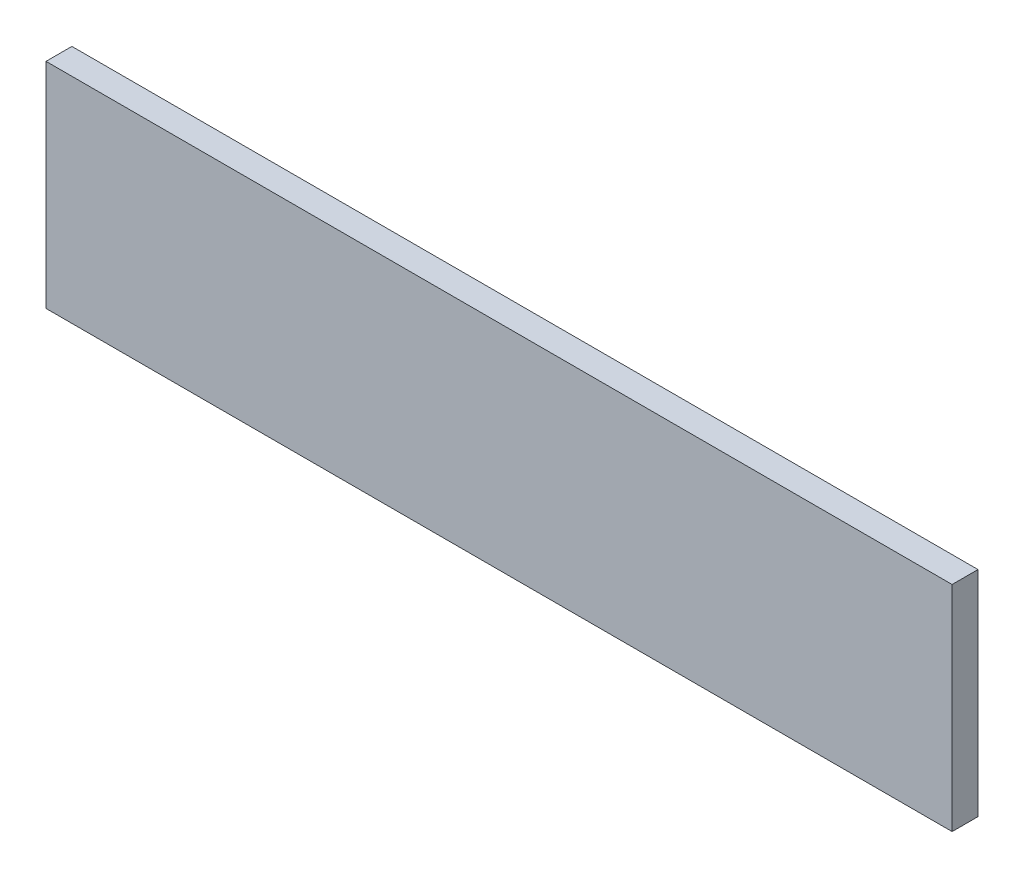
ISO-10303-21;
HEADER;
FILE_DESCRIPTION(('STEP AP214'),'2;1');
FILE_NAME('part.step','',(''),(''),'','','');
FILE_SCHEMA(('AUTOMOTIVE_DESIGN { 1 0 10303 214 1 1 1 1 }'));
ENDSEC;
DATA;
#1=APPLICATION_CONTEXT('core data for automotive mechanical design processes');
#2=APPLICATION_PROTOCOL_DEFINITION('international standard','automotive_design',2000,#1);
#3=PRODUCT_CONTEXT('',#1,'mechanical');
#4=PRODUCT('Part','Part','',(#3));
#5=PRODUCT_RELATED_PRODUCT_CATEGORY('part','',(#4));
#6=PRODUCT_DEFINITION_FORMATION('','',#4);
#7=PRODUCT_DEFINITION_CONTEXT('part definition',#1,'design');
#8=PRODUCT_DEFINITION('design','',#6,#7);
#9=PRODUCT_DEFINITION_SHAPE('','',#8);
#10=(LENGTH_UNIT() NAMED_UNIT(*) SI_UNIT(.MILLI.,.METRE.));
#11=(NAMED_UNIT(*) PLANE_ANGLE_UNIT() SI_UNIT($,.RADIAN.));
#12=(NAMED_UNIT(*) SI_UNIT($,.STERADIAN.) SOLID_ANGLE_UNIT());
#13=UNCERTAINTY_MEASURE_WITH_UNIT(LENGTH_MEASURE(1.E-05),#10,'distance_accuracy_value','');
#14=(GEOMETRIC_REPRESENTATION_CONTEXT(3) GLOBAL_UNCERTAINTY_ASSIGNED_CONTEXT((#13)) GLOBAL_UNIT_ASSIGNED_CONTEXT((#10,
#11,#12)) REPRESENTATION_CONTEXT('',''));
#15=CARTESIAN_POINT('',(0.,0.,0.));
#16=DIRECTION('',(0.,0.,1.));
#17=DIRECTION('',(1.,0.,0.));
#18=AXIS2_PLACEMENT_3D('',#15,#16,#17);
#19=CARTESIAN_POINT('',(105.,0.,0.));
#20=DIRECTION('',(0.,0.,-1.));
#21=DIRECTION('',(-1.,0.,0.));
#22=AXIS2_PLACEMENT_3D('',#19,#20,#21);
#23=PLANE('',#22);
#24=DIRECTION('',(0.,-1.,0.));
#25=VECTOR('',#24,1.);
#26=CARTESIAN_POINT('',(0.,0.,0.));
#27=LINE('',#26,#25);
#28=CARTESIAN_POINT('',(0.,24.8,0.));
#29=VERTEX_POINT('',#28);
#30=CARTESIAN_POINT('',(0.,0.,0.));
#31=VERTEX_POINT('',#30);
#32=EDGE_CURVE('E107',#29,#31,#27,.T.);
#33=ORIENTED_EDGE('',*,*,#32,.T.);
#34=DIRECTION('',(-1.,0.,0.));
#35=VECTOR('',#34,1.);
#36=CARTESIAN_POINT('',(105.,0.,0.));
#37=LINE('',#36,#35);
#38=CARTESIAN_POINT('',(105.,0.,0.));
#39=VERTEX_POINT('',#38);
#40=EDGE_CURVE('E11',#39,#31,#37,.T.);
#41=ORIENTED_EDGE('',*,*,#40,.F.);
#42=DIRECTION('',(0.,-1.,0.));
#43=VECTOR('',#42,1.);
#44=CARTESIAN_POINT('',(105.,0.,0.));
#45=LINE('',#44,#43);
#46=CARTESIAN_POINT('',(105.,24.8,0.));
#47=VERTEX_POINT('',#46);
#48=EDGE_CURVE('E91',#47,#39,#45,.T.);
#49=ORIENTED_EDGE('',*,*,#48,.F.);
#50=DIRECTION('',(-1.,0.,0.));
#51=VECTOR('',#50,1.);
#52=CARTESIAN_POINT('',(105.,24.8,0.));
#53=LINE('',#52,#51);
#54=EDGE_CURVE('E103',#47,#29,#53,.T.);
#55=ORIENTED_EDGE('',*,*,#54,.T.);
#56=EDGE_LOOP('',(#33,#41,#49,#55));
#57=FACE_BOUND('',#56,.T.);
#58=ADVANCED_FACE('F39',(#57),#23,.F.);
#59=CARTESIAN_POINT('',(105.,0.,0.));
#60=DIRECTION('',(0.,1.,0.));
#61=DIRECTION('',(0.,0.,1.));
#62=AXIS2_PLACEMENT_3D('',#59,#60,#61);
#63=PLANE('',#62);
#64=DIRECTION('',(0.,0.,-1.));
#65=VECTOR('',#64,1.);
#66=CARTESIAN_POINT('',(0.,0.,0.));
#67=LINE('',#66,#65);
#68=CARTESIAN_POINT('',(0.,0.,-3.));
#69=VERTEX_POINT('',#68);
#70=EDGE_CURVE('E96',#31,#69,#67,.T.);
#71=ORIENTED_EDGE('',*,*,#70,.T.);
#72=DIRECTION('',(-1.,0.,0.));
#73=VECTOR('',#72,1.);
#74=CARTESIAN_POINT('',(105.,0.,-3.));
#75=LINE('',#74,#73);
#76=CARTESIAN_POINT('',(105.,0.,-3.));
#77=VERTEX_POINT('',#76);
#78=EDGE_CURVE('E48',#77,#69,#75,.T.);
#79=ORIENTED_EDGE('',*,*,#78,.F.);
#80=DIRECTION('',(0.,0.,-1.));
#81=VECTOR('',#80,1.);
#82=CARTESIAN_POINT('',(105.,0.,0.));
#83=LINE('',#82,#81);
#84=EDGE_CURVE('E86',#39,#77,#83,.T.);
#85=ORIENTED_EDGE('',*,*,#84,.F.);
#86=ORIENTED_EDGE('',*,*,#40,.T.);
#87=EDGE_LOOP('',(#71,#79,#85,#86));
#88=FACE_BOUND('',#87,.T.);
#89=ADVANCED_FACE('F95',(#88),#63,.F.);
#90=CARTESIAN_POINT('',(105.,0.,-3.));
#91=DIRECTION('',(0.,0.,1.));
#92=DIRECTION('',(0.,-1.,0.));
#93=AXIS2_PLACEMENT_3D('',#90,#91,#92);
#94=PLANE('',#93);
#95=DIRECTION('',(0.,1.,0.));
#96=VECTOR('',#95,1.);
#97=CARTESIAN_POINT('',(0.,0.,-3.));
#98=LINE('',#97,#96);
#99=CARTESIAN_POINT('',(0.,24.8,-3.));
#100=VERTEX_POINT('',#99);
#101=EDGE_CURVE('E73',#69,#100,#98,.T.);
#102=ORIENTED_EDGE('',*,*,#101,.T.);
#103=DIRECTION('',(-1.,0.,0.));
#104=VECTOR('',#103,1.);
#105=CARTESIAN_POINT('',(105.,24.8,-3.));
#106=LINE('',#105,#104);
#107=CARTESIAN_POINT('',(105.,24.8,-3.));
#108=VERTEX_POINT('',#107);
#109=EDGE_CURVE('E98',#108,#100,#106,.T.);
#110=ORIENTED_EDGE('',*,*,#109,.F.);
#111=DIRECTION('',(0.,1.,0.));
#112=VECTOR('',#111,1.);
#113=CARTESIAN_POINT('',(105.,0.,-3.));
#114=LINE('',#113,#112);
#115=EDGE_CURVE('E89',#77,#108,#114,.T.);
#116=ORIENTED_EDGE('',*,*,#115,.F.);
#117=ORIENTED_EDGE('',*,*,#78,.T.);
#118=EDGE_LOOP('',(#102,#110,#116,#117));
#119=FACE_BOUND('',#118,.T.);
#120=ADVANCED_FACE('F99',(#119),#94,.F.);
#121=CARTESIAN_POINT('',(105.,24.8,0.));
#122=DIRECTION('',(0.,-1.,0.));
#123=DIRECTION('',(0.,0.,-1.));
#124=AXIS2_PLACEMENT_3D('',#121,#122,#123);
#125=PLANE('',#124);
#126=DIRECTION('',(0.,0.,1.));
#127=VECTOR('',#126,1.);
#128=CARTESIAN_POINT('',(0.,24.8,0.));
#129=LINE('',#128,#127);
#130=EDGE_CURVE('E79',#100,#29,#129,.T.);
#131=ORIENTED_EDGE('',*,*,#130,.T.);
#132=ORIENTED_EDGE('',*,*,#54,.F.);
#133=DIRECTION('',(0.,0.,1.));
#134=VECTOR('',#133,1.);
#135=CARTESIAN_POINT('',(105.,24.8,0.));
#136=LINE('',#135,#134);
#137=EDGE_CURVE('E56',#108,#47,#136,.T.);
#138=ORIENTED_EDGE('',*,*,#137,.F.);
#139=ORIENTED_EDGE('',*,*,#109,.T.);
#140=EDGE_LOOP('',(#131,#132,#138,#139));
#141=FACE_BOUND('',#140,.T.);
#142=ADVANCED_FACE('F120',(#141),#125,.F.);
#143=CARTESIAN_POINT('',(105.,0.,0.));
#144=DIRECTION('',(-1.,0.,0.));
#145=DIRECTION('',(0.,0.,1.));
#146=AXIS2_PLACEMENT_3D('',#143,#144,#145);
#147=PLANE('',#146);
#148=ORIENTED_EDGE('',*,*,#48,.T.);
#149=ORIENTED_EDGE('',*,*,#84,.T.);
#150=ORIENTED_EDGE('',*,*,#115,.T.);
#151=ORIENTED_EDGE('',*,*,#137,.T.);
#152=EDGE_LOOP('',(#148,#149,#150,#151));
#153=FACE_BOUND('',#152,.T.);
#154=ADVANCED_FACE('F87',(#153),#147,.F.);
#155=CARTESIAN_POINT('',(0.,0.,0.));
#156=DIRECTION('',(-1.,0.,0.));
#157=DIRECTION('',(0.,0.,1.));
#158=AXIS2_PLACEMENT_3D('',#155,#156,#157);
#159=PLANE('',#158);
#160=ORIENTED_EDGE('',*,*,#32,.F.);
#161=ORIENTED_EDGE('',*,*,#130,.F.);
#162=ORIENTED_EDGE('',*,*,#101,.F.);
#163=ORIENTED_EDGE('',*,*,#70,.F.);
#164=EDGE_LOOP('',(#160,#161,#162,#163));
#165=FACE_BOUND('',#164,.T.);
#166=ADVANCED_FACE('F123',(#165),#159,.T.);
#167=CLOSED_SHELL('',(#58,#89,#120,#142,#154,#166));
#168=MANIFOLD_SOLID_BREP('B2',#167);
#169=ADVANCED_BREP_SHAPE_REPRESENTATION('',(#18,#168),#14);
#170=SHAPE_DEFINITION_REPRESENTATION(#9,#169);
ENDSEC;
END-ISO-10303-21;
